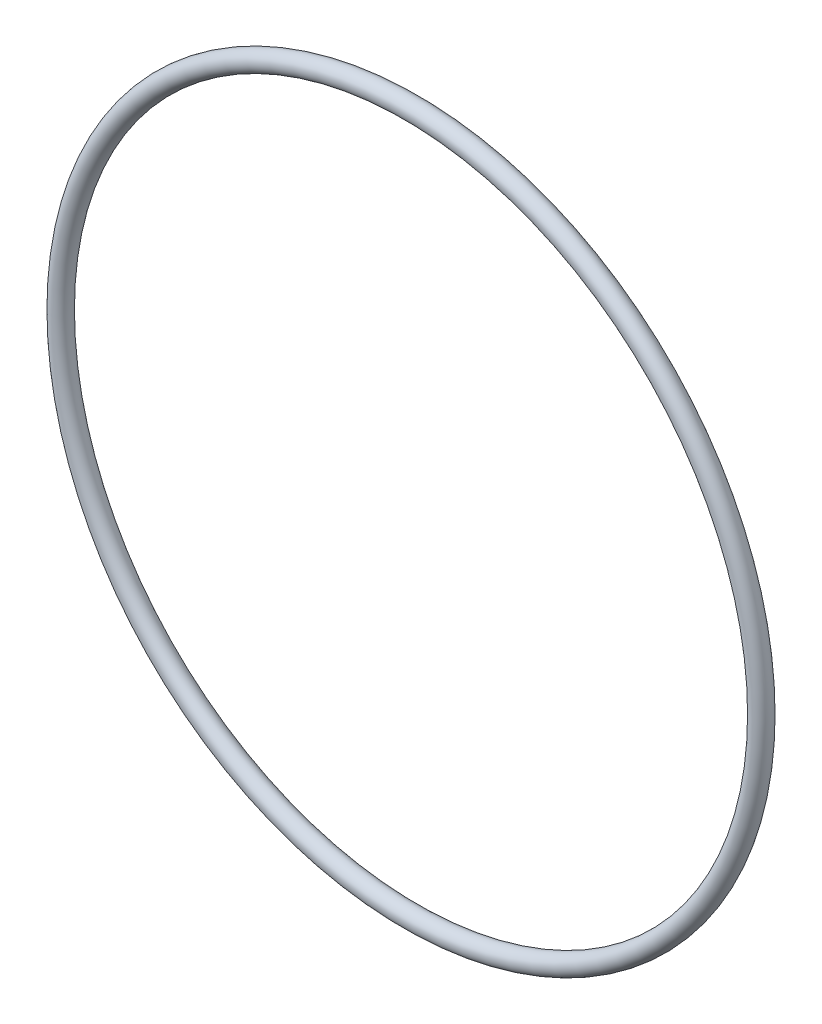
ISO-10303-21;
HEADER;
FILE_DESCRIPTION(('STEP AP214'),'2;1');
FILE_NAME('part.step','',(''),(''),'','','');
FILE_SCHEMA(('AUTOMOTIVE_DESIGN { 1 0 10303 214 1 1 1 1 }'));
ENDSEC;
DATA;
#1=APPLICATION_CONTEXT('core data for automotive mechanical design processes');
#2=APPLICATION_PROTOCOL_DEFINITION('international standard','automotive_design',2000,#1);
#3=PRODUCT_CONTEXT('',#1,'mechanical');
#4=PRODUCT('Part','Part','',(#3));
#5=PRODUCT_RELATED_PRODUCT_CATEGORY('part','',(#4));
#6=PRODUCT_DEFINITION_FORMATION('','',#4);
#7=PRODUCT_DEFINITION_CONTEXT('part definition',#1,'design');
#8=PRODUCT_DEFINITION('design','',#6,#7);
#9=PRODUCT_DEFINITION_SHAPE('','',#8);
#10=(LENGTH_UNIT() NAMED_UNIT(*) SI_UNIT(.MILLI.,.METRE.));
#11=(NAMED_UNIT(*) PLANE_ANGLE_UNIT() SI_UNIT($,.RADIAN.));
#12=(NAMED_UNIT(*) SI_UNIT($,.STERADIAN.) SOLID_ANGLE_UNIT());
#13=UNCERTAINTY_MEASURE_WITH_UNIT(LENGTH_MEASURE(1.E-05),#10,'distance_accuracy_value','');
#14=(GEOMETRIC_REPRESENTATION_CONTEXT(3) GLOBAL_UNCERTAINTY_ASSIGNED_CONTEXT((#13)) GLOBAL_UNIT_ASSIGNED_CONTEXT((#10,
#11,#12)) REPRESENTATION_CONTEXT('',''));
#15=CARTESIAN_POINT('',(0.,0.,0.));
#16=DIRECTION('',(0.,0.,1.));
#17=DIRECTION('',(1.,0.,0.));
#18=AXIS2_PLACEMENT_3D('',#15,#16,#17);
#19=CARTESIAN_POINT('',(0.,0.,0.));
#20=DIRECTION('',(0.,0.,1.));
#21=DIRECTION('',(1.,0.,0.));
#22=AXIS2_PLACEMENT_3D('',#19,#20,#21);
#23=TOROIDAL_SURFACE('',#22,108.,3.00000000000001);
#24=CARTESIAN_POINT('',(111.,0.,0.));
#25=VERTEX_POINT('',#24);
#26=VERTEX_LOOP('',#25);
#27=FACE_BOUND('',#26,.T.);
#28=ADVANCED_FACE('F31',(#27),#23,.T.);
#29=CLOSED_SHELL('',(#28));
#30=MANIFOLD_SOLID_BREP('B2',#29);
#31=ADVANCED_BREP_SHAPE_REPRESENTATION('',(#18,#30),#14);
#32=SHAPE_DEFINITION_REPRESENTATION(#9,#31);
ENDSEC;
END-ISO-10303-21;
